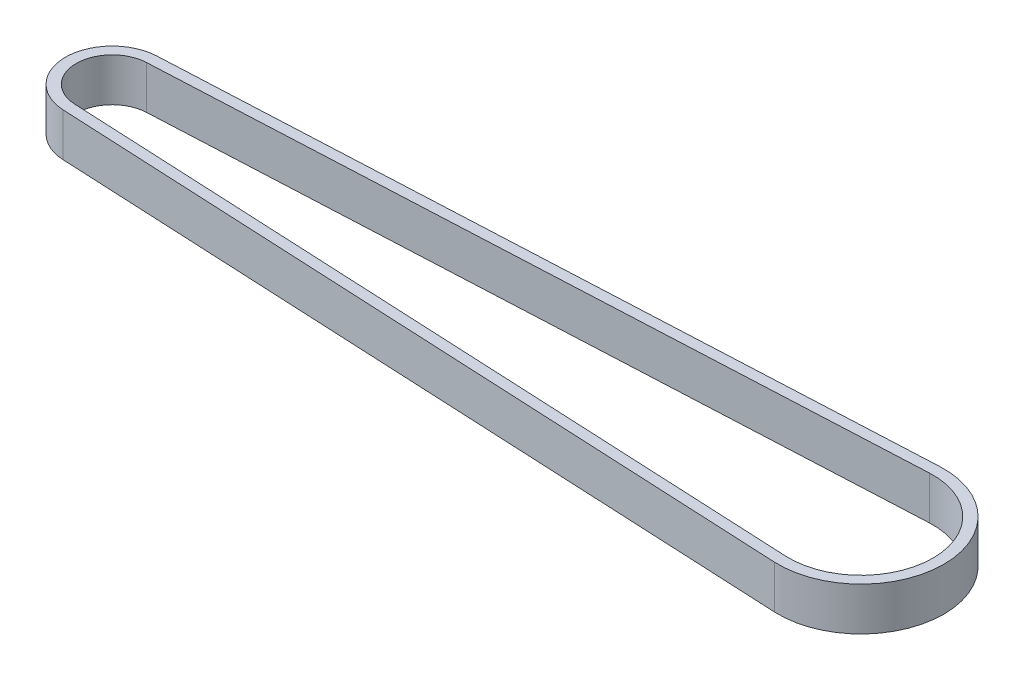
ISO-10303-21;
HEADER;
FILE_DESCRIPTION(('STEP AP214'),'2;1');
FILE_NAME('part.step','',(''),(''),'','','');
FILE_SCHEMA(('AUTOMOTIVE_DESIGN { 1 0 10303 214 1 1 1 1 }'));
ENDSEC;
DATA;
#1=APPLICATION_CONTEXT('core data for automotive mechanical design processes');
#2=APPLICATION_PROTOCOL_DEFINITION('international standard','automotive_design',2000,#1);
#3=PRODUCT_CONTEXT('',#1,'mechanical');
#4=PRODUCT('Part','Part','',(#3));
#5=PRODUCT_RELATED_PRODUCT_CATEGORY('part','',(#4));
#6=PRODUCT_DEFINITION_FORMATION('','',#4);
#7=PRODUCT_DEFINITION_CONTEXT('part definition',#1,'design');
#8=PRODUCT_DEFINITION('design','',#6,#7);
#9=PRODUCT_DEFINITION_SHAPE('','',#8);
#10=(LENGTH_UNIT() NAMED_UNIT(*) SI_UNIT(.MILLI.,.METRE.));
#11=(NAMED_UNIT(*) PLANE_ANGLE_UNIT() SI_UNIT($,.RADIAN.));
#12=(NAMED_UNIT(*) SI_UNIT($,.STERADIAN.) SOLID_ANGLE_UNIT());
#13=UNCERTAINTY_MEASURE_WITH_UNIT(LENGTH_MEASURE(1.E-05),#10,'distance_accuracy_value','');
#14=(GEOMETRIC_REPRESENTATION_CONTEXT(3) GLOBAL_UNCERTAINTY_ASSIGNED_CONTEXT((#13)) GLOBAL_UNIT_ASSIGNED_CONTEXT((#10,
#11,#12)) REPRESENTATION_CONTEXT('',''));
#15=CARTESIAN_POINT('',(0.,0.,0.));
#16=DIRECTION('',(0.,0.,1.));
#17=DIRECTION('',(1.,0.,0.));
#18=AXIS2_PLACEMENT_3D('',#15,#16,#17);
#19=CARTESIAN_POINT('',(0.,3.,0.));
#20=DIRECTION('',(0.,1.,0.));
#21=DIRECTION('',(0.,0.,1.));
#22=AXIS2_PLACEMENT_3D('',#19,#20,#21);
#23=PLANE('',#22);
#24=CARTESIAN_POINT('',(0.,3.,0.));
#25=DIRECTION('',(0.,1.,0.));
#26=DIRECTION('',(0.,0.,1.));
#27=AXIS2_PLACEMENT_3D('',#24,#25,#26);
#28=CIRCLE('',#27,6.5);
#29=CARTESIAN_POINT('',(-0.312560107713031,3.,-6.49248074152449));
#30=VERTEX_POINT('',#29);
#31=CARTESIAN_POINT('',(-0.312560107713038,3.,6.4924807415245));
#32=VERTEX_POINT('',#31);
#33=EDGE_CURVE('E134',#30,#32,#28,.T.);
#34=ORIENTED_EDGE('',*,*,#33,.T.);
#35=DIRECTION('',(0.998843191003768,0.,0.0480861704173879));
#36=VECTOR('',#35,1.);
#37=CARTESIAN_POINT('',(103.4270090402,3.,11.4866966965433));
#38=LINE('',#37,#36);
#39=CARTESIAN_POINT('',(103.4270090402,3.,11.4866966965433));
#40=VERTEX_POINT('',#39);
#41=EDGE_CURVE('E137',#32,#40,#38,.T.);
#42=ORIENTED_EDGE('',*,*,#41,.T.);
#43=CARTESIAN_POINT('',(103.98,3.,0.));
#44=DIRECTION('',(0.,1.,0.));
#45=DIRECTION('',(0.,0.,-1.));
#46=AXIS2_PLACEMENT_3D('',#43,#44,#45);
#47=CIRCLE('',#46,11.5);
#48=CARTESIAN_POINT('',(103.4270090402,3.,-11.4866966965433));
#49=VERTEX_POINT('',#48);
#50=EDGE_CURVE('E140',#40,#49,#47,.T.);
#51=ORIENTED_EDGE('',*,*,#50,.T.);
#52=DIRECTION('',(-0.998843191003768,0.,0.0480861704173879));
#53=VECTOR('',#52,1.);
#54=CARTESIAN_POINT('',(-0.312560107713031,3.,-6.49248074152449));
#55=LINE('',#54,#53);
#56=EDGE_CURVE('E142',#49,#30,#55,.T.);
#57=ORIENTED_EDGE('',*,*,#56,.T.);
#58=EDGE_LOOP('',(#34,#42,#51,#57));
#59=FACE_BOUND('',#58,.T.);
#60=DIRECTION('',(0.998843191003768,0.,0.0480861704173879));
#61=VECTOR('',#60,1.);
#62=CARTESIAN_POINT('',(103.499138295826,3.,9.98843191003768));
#63=LINE('',#62,#61);
#64=CARTESIAN_POINT('',(-0.240430852086944,3.,4.99421595501885));
#65=VERTEX_POINT('',#64);
#66=CARTESIAN_POINT('',(103.499138295826,3.,9.98843191003768));
#67=VERTEX_POINT('',#66);
#68=EDGE_CURVE('E106',#65,#67,#63,.T.);
#69=ORIENTED_EDGE('',*,*,#68,.F.);
#70=CARTESIAN_POINT('',(0.,3.,0.));
#71=DIRECTION('',(0.,1.,0.));
#72=DIRECTION('',(0.,0.,1.));
#73=AXIS2_PLACEMENT_3D('',#70,#71,#72);
#74=CIRCLE('',#73,5.);
#75=CARTESIAN_POINT('',(-0.240430852086945,3.,-4.99421595501884));
#76=VERTEX_POINT('',#75);
#77=EDGE_CURVE('E98',#76,#65,#74,.T.);
#78=ORIENTED_EDGE('',*,*,#77,.F.);
#79=DIRECTION('',(-0.998843191003768,0.,0.048086170417388));
#80=VECTOR('',#79,1.);
#81=CARTESIAN_POINT('',(-0.240430852086945,3.,-4.99421595501884));
#82=LINE('',#81,#80);
#83=CARTESIAN_POINT('',(103.499138295826,3.,-9.98843191003768));
#84=VERTEX_POINT('',#83);
#85=EDGE_CURVE('E120',#84,#76,#82,.T.);
#86=ORIENTED_EDGE('',*,*,#85,.F.);
#87=CARTESIAN_POINT('',(103.98,3.,0.));
#88=DIRECTION('',(0.,1.,0.));
#89=DIRECTION('',(0.,0.,-1.));
#90=AXIS2_PLACEMENT_3D('',#87,#88,#89);
#91=CIRCLE('',#90,10.);
#92=EDGE_CURVE('E118',#67,#84,#91,.T.);
#93=ORIENTED_EDGE('',*,*,#92,.F.);
#94=EDGE_LOOP('',(#69,#78,#86,#93));
#95=FACE_BOUND('',#94,.T.);
#96=ADVANCED_FACE('F33',(#59,#95),#23,.T.);
#97=CARTESIAN_POINT('',(0.,-3.,0.));
#98=DIRECTION('',(0.,1.,0.));
#99=DIRECTION('',(0.,0.,1.));
#100=AXIS2_PLACEMENT_3D('',#97,#98,#99);
#101=PLANE('',#100);
#102=CARTESIAN_POINT('',(0.,-3.,0.));
#103=DIRECTION('',(0.,1.,0.));
#104=DIRECTION('',(0.,0.,1.));
#105=AXIS2_PLACEMENT_3D('',#102,#103,#104);
#106=CIRCLE('',#105,6.5);
#107=CARTESIAN_POINT('',(-0.312560107713031,-3.,-6.49248074152449));
#108=VERTEX_POINT('',#107);
#109=CARTESIAN_POINT('',(-0.312560107713038,-3.,6.4924807415245));
#110=VERTEX_POINT('',#109);
#111=EDGE_CURVE('E114',#108,#110,#106,.T.);
#112=ORIENTED_EDGE('',*,*,#111,.F.);
#113=DIRECTION('',(-0.998843191003768,0.,0.0480861704173879));
#114=VECTOR('',#113,1.);
#115=CARTESIAN_POINT('',(-0.312560107713031,-3.,-6.49248074152449));
#116=LINE('',#115,#114);
#117=CARTESIAN_POINT('',(103.4270090402,-3.,-11.4866966965433));
#118=VERTEX_POINT('',#117);
#119=EDGE_CURVE('E138',#118,#108,#116,.T.);
#120=ORIENTED_EDGE('',*,*,#119,.F.);
#121=CARTESIAN_POINT('',(103.98,-3.,0.));
#122=DIRECTION('',(0.,1.,0.));
#123=DIRECTION('',(0.,0.,-1.));
#124=AXIS2_PLACEMENT_3D('',#121,#122,#123);
#125=CIRCLE('',#124,11.5);
#126=CARTESIAN_POINT('',(103.4270090402,-3.,11.4866966965433));
#127=VERTEX_POINT('',#126);
#128=EDGE_CURVE('E149',#127,#118,#125,.T.);
#129=ORIENTED_EDGE('',*,*,#128,.F.);
#130=DIRECTION('',(0.998843191003768,0.,0.0480861704173879));
#131=VECTOR('',#130,1.);
#132=CARTESIAN_POINT('',(103.4270090402,-3.,11.4866966965433));
#133=LINE('',#132,#131);
#134=EDGE_CURVE('E147',#110,#127,#133,.T.);
#135=ORIENTED_EDGE('',*,*,#134,.F.);
#136=EDGE_LOOP('',(#112,#120,#129,#135));
#137=FACE_BOUND('',#136,.T.);
#138=CARTESIAN_POINT('',(0.,-3.,0.));
#139=DIRECTION('',(0.,1.,0.));
#140=DIRECTION('',(0.,0.,1.));
#141=AXIS2_PLACEMENT_3D('',#138,#139,#140);
#142=CIRCLE('',#141,5.);
#143=CARTESIAN_POINT('',(-0.240430852086945,-3.,-4.99421595501884));
#144=VERTEX_POINT('',#143);
#145=CARTESIAN_POINT('',(-0.240430852086944,-3.,4.99421595501885));
#146=VERTEX_POINT('',#145);
#147=EDGE_CURVE('E56',#144,#146,#142,.T.);
#148=ORIENTED_EDGE('',*,*,#147,.T.);
#149=DIRECTION('',(0.998843191003768,0.,0.0480861704173879));
#150=VECTOR('',#149,1.);
#151=CARTESIAN_POINT('',(103.499138295826,-3.,9.98843191003768));
#152=LINE('',#151,#150);
#153=CARTESIAN_POINT('',(103.499138295826,-3.,9.98843191003768));
#154=VERTEX_POINT('',#153);
#155=EDGE_CURVE('E113',#146,#154,#152,.T.);
#156=ORIENTED_EDGE('',*,*,#155,.T.);
#157=CARTESIAN_POINT('',(103.98,-3.,0.));
#158=DIRECTION('',(0.,1.,0.));
#159=DIRECTION('',(0.,0.,-1.));
#160=AXIS2_PLACEMENT_3D('',#157,#158,#159);
#161=CIRCLE('',#160,10.);
#162=CARTESIAN_POINT('',(103.499138295826,-3.,-9.98843191003768));
#163=VERTEX_POINT('',#162);
#164=EDGE_CURVE('E126',#154,#163,#161,.T.);
#165=ORIENTED_EDGE('',*,*,#164,.T.);
#166=DIRECTION('',(-0.998843191003768,0.,0.048086170417388));
#167=VECTOR('',#166,1.);
#168=CARTESIAN_POINT('',(-0.240430852086945,-3.,-4.99421595501884));
#169=LINE('',#168,#167);
#170=EDGE_CURVE('E107',#163,#144,#169,.T.);
#171=ORIENTED_EDGE('',*,*,#170,.T.);
#172=EDGE_LOOP('',(#148,#156,#165,#171));
#173=FACE_BOUND('',#172,.T.);
#174=ADVANCED_FACE('F167',(#137,#173),#101,.F.);
#175=CARTESIAN_POINT('',(0.,3.,0.));
#176=DIRECTION('',(0.,-1.,0.));
#177=DIRECTION('',(0.,0.,-1.));
#178=AXIS2_PLACEMENT_3D('',#175,#176,#177);
#179=CYLINDRICAL_SURFACE('',#178,6.5);
#180=ORIENTED_EDGE('',*,*,#111,.T.);
#181=DIRECTION('',(0.,-1.,0.));
#182=VECTOR('',#181,1.);
#183=CARTESIAN_POINT('',(-0.312560107713038,3.,6.4924807415245));
#184=LINE('',#183,#182);
#185=EDGE_CURVE('E11',#32,#110,#184,.T.);
#186=ORIENTED_EDGE('',*,*,#185,.F.);
#187=ORIENTED_EDGE('',*,*,#33,.F.);
#188=DIRECTION('',(0.,-1.,0.));
#189=VECTOR('',#188,1.);
#190=CARTESIAN_POINT('',(-0.312560107713031,3.,-6.49248074152449));
#191=LINE('',#190,#189);
#192=EDGE_CURVE('E144',#30,#108,#191,.T.);
#193=ORIENTED_EDGE('',*,*,#192,.T.);
#194=EDGE_LOOP('',(#180,#186,#187,#193));
#195=FACE_BOUND('',#194,.T.);
#196=ADVANCED_FACE('F35',(#195),#179,.T.);
#197=CARTESIAN_POINT('',(103.4270090402,3.,11.4866966965433));
#198=DIRECTION('',(0.0480861704173879,0.,-0.998843191003768));
#199=DIRECTION('',(-0.998843191003768,0.,-0.0480861704173879));
#200=AXIS2_PLACEMENT_3D('',#197,#198,#199);
#201=PLANE('',#200);
#202=ORIENTED_EDGE('',*,*,#134,.T.);
#203=DIRECTION('',(0.,-1.,0.));
#204=VECTOR('',#203,1.);
#205=CARTESIAN_POINT('',(103.4270090402,3.,11.4866966965433));
#206=LINE('',#205,#204);
#207=EDGE_CURVE('E41',#40,#127,#206,.T.);
#208=ORIENTED_EDGE('',*,*,#207,.F.);
#209=ORIENTED_EDGE('',*,*,#41,.F.);
#210=ORIENTED_EDGE('',*,*,#185,.T.);
#211=EDGE_LOOP('',(#202,#208,#209,#210));
#212=FACE_BOUND('',#211,.T.);
#213=ADVANCED_FACE('F177',(#212),#201,.F.);
#214=CARTESIAN_POINT('',(103.98,3.,0.));
#215=DIRECTION('',(0.,-1.,0.));
#216=DIRECTION('',(0.,0.,-1.));
#217=AXIS2_PLACEMENT_3D('',#214,#215,#216);
#218=CYLINDRICAL_SURFACE('',#217,11.5);
#219=ORIENTED_EDGE('',*,*,#128,.T.);
#220=DIRECTION('',(0.,-1.,0.));
#221=VECTOR('',#220,1.);
#222=CARTESIAN_POINT('',(103.4270090402,3.,-11.4866966965433));
#223=LINE('',#222,#221);
#224=EDGE_CURVE('E154',#49,#118,#223,.T.);
#225=ORIENTED_EDGE('',*,*,#224,.F.);
#226=ORIENTED_EDGE('',*,*,#50,.F.);
#227=ORIENTED_EDGE('',*,*,#207,.T.);
#228=EDGE_LOOP('',(#219,#225,#226,#227));
#229=FACE_BOUND('',#228,.T.);
#230=ADVANCED_FACE('F161',(#229),#218,.T.);
#231=CARTESIAN_POINT('',(-0.312560107713031,3.,-6.49248074152449));
#232=DIRECTION('',(0.0480861704173879,0.,0.998843191003768));
#233=DIRECTION('',(0.998843191003768,0.,-0.0480861704173879));
#234=AXIS2_PLACEMENT_3D('',#231,#232,#233);
#235=PLANE('',#234);
#236=ORIENTED_EDGE('',*,*,#119,.T.);
#237=ORIENTED_EDGE('',*,*,#192,.F.);
#238=ORIENTED_EDGE('',*,*,#56,.F.);
#239=ORIENTED_EDGE('',*,*,#224,.T.);
#240=EDGE_LOOP('',(#236,#237,#238,#239));
#241=FACE_BOUND('',#240,.T.);
#242=ADVANCED_FACE('F171',(#241),#235,.F.);
#243=CARTESIAN_POINT('',(0.,3.,0.));
#244=DIRECTION('',(0.,-1.,0.));
#245=DIRECTION('',(0.,0.,-1.));
#246=AXIS2_PLACEMENT_3D('',#243,#244,#245);
#247=CYLINDRICAL_SURFACE('',#246,5.);
#248=ORIENTED_EDGE('',*,*,#147,.F.);
#249=DIRECTION('',(0.,-1.,0.));
#250=VECTOR('',#249,1.);
#251=CARTESIAN_POINT('',(-0.240430852086945,3.,-4.99421595501884));
#252=LINE('',#251,#250);
#253=EDGE_CURVE('E102',#76,#144,#252,.T.);
#254=ORIENTED_EDGE('',*,*,#253,.F.);
#255=ORIENTED_EDGE('',*,*,#77,.T.);
#256=DIRECTION('',(0.,-1.,0.));
#257=VECTOR('',#256,1.);
#258=CARTESIAN_POINT('',(-0.240430852086944,3.,4.99421595501885));
#259=LINE('',#258,#257);
#260=EDGE_CURVE('E101',#65,#146,#259,.T.);
#261=ORIENTED_EDGE('',*,*,#260,.T.);
#262=EDGE_LOOP('',(#248,#254,#255,#261));
#263=FACE_BOUND('',#262,.T.);
#264=ADVANCED_FACE('F100',(#263),#247,.F.);
#265=CARTESIAN_POINT('',(103.499138295826,3.,9.98843191003768));
#266=DIRECTION('',(0.0480861704173879,0.,-0.998843191003768));
#267=DIRECTION('',(-0.998843191003768,0.,-0.0480861704173879));
#268=AXIS2_PLACEMENT_3D('',#265,#266,#267);
#269=PLANE('',#268);
#270=ORIENTED_EDGE('',*,*,#155,.F.);
#271=ORIENTED_EDGE('',*,*,#260,.F.);
#272=ORIENTED_EDGE('',*,*,#68,.T.);
#273=DIRECTION('',(0.,-1.,0.));
#274=VECTOR('',#273,1.);
#275=CARTESIAN_POINT('',(103.499138295826,3.,9.98843191003768));
#276=LINE('',#275,#274);
#277=EDGE_CURVE('E115',#67,#154,#276,.T.);
#278=ORIENTED_EDGE('',*,*,#277,.T.);
#279=EDGE_LOOP('',(#270,#271,#272,#278));
#280=FACE_BOUND('',#279,.T.);
#281=ADVANCED_FACE('F110',(#280),#269,.T.);
#282=CARTESIAN_POINT('',(103.98,3.,0.));
#283=DIRECTION('',(0.,-1.,0.));
#284=DIRECTION('',(0.,0.,-1.));
#285=AXIS2_PLACEMENT_3D('',#282,#283,#284);
#286=CYLINDRICAL_SURFACE('',#285,10.);
#287=ORIENTED_EDGE('',*,*,#164,.F.);
#288=ORIENTED_EDGE('',*,*,#277,.F.);
#289=ORIENTED_EDGE('',*,*,#92,.T.);
#290=DIRECTION('',(0.,-1.,0.));
#291=VECTOR('',#290,1.);
#292=CARTESIAN_POINT('',(103.499138295826,3.,-9.98843191003768));
#293=LINE('',#292,#291);
#294=EDGE_CURVE('E48',#84,#163,#293,.T.);
#295=ORIENTED_EDGE('',*,*,#294,.T.);
#296=EDGE_LOOP('',(#287,#288,#289,#295));
#297=FACE_BOUND('',#296,.T.);
#298=ADVANCED_FACE('F200',(#297),#286,.F.);
#299=CARTESIAN_POINT('',(-0.240430852086945,3.,-4.99421595501884));
#300=DIRECTION('',(0.048086170417388,0.,0.998843191003768));
#301=DIRECTION('',(0.998843191003768,0.,-0.048086170417388));
#302=AXIS2_PLACEMENT_3D('',#299,#300,#301);
#303=PLANE('',#302);
#304=ORIENTED_EDGE('',*,*,#170,.F.);
#305=ORIENTED_EDGE('',*,*,#294,.F.);
#306=ORIENTED_EDGE('',*,*,#85,.T.);
#307=ORIENTED_EDGE('',*,*,#253,.T.);
#308=EDGE_LOOP('',(#304,#305,#306,#307));
#309=FACE_BOUND('',#308,.T.);
#310=ADVANCED_FACE('F204',(#309),#303,.T.);
#311=CLOSED_SHELL('',(#96,#174,#196,#213,#230,#242,#264,#281,#298,#310));
#312=MANIFOLD_SOLID_BREP('B2',#311);
#313=ADVANCED_BREP_SHAPE_REPRESENTATION('',(#18,#312),#14);
#314=SHAPE_DEFINITION_REPRESENTATION(#9,#313);
ENDSEC;
END-ISO-10303-21;
